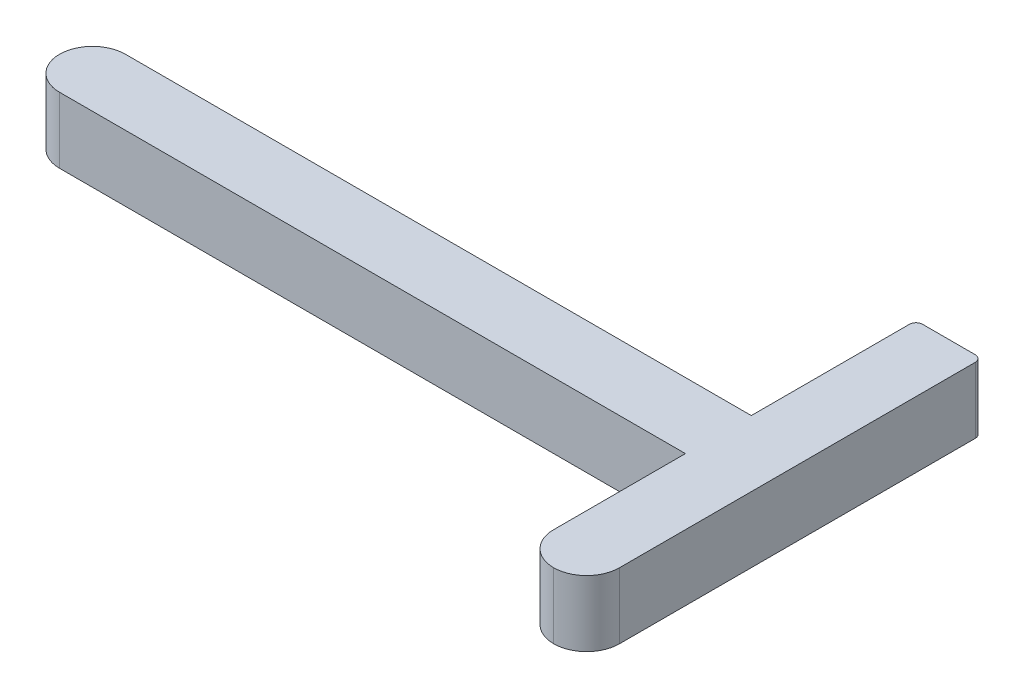
ISO-10303-21;
HEADER;
FILE_DESCRIPTION(('STEP AP214'),'2;1');
FILE_NAME('part.step','',(''),(''),'','','');
FILE_SCHEMA(('AUTOMOTIVE_DESIGN { 1 0 10303 214 1 1 1 1 }'));
ENDSEC;
DATA;
#1=APPLICATION_CONTEXT('core data for automotive mechanical design processes');
#2=APPLICATION_PROTOCOL_DEFINITION('international standard','automotive_design',2000,#1);
#3=PRODUCT_CONTEXT('',#1,'mechanical');
#4=PRODUCT('Part','Part','',(#3));
#5=PRODUCT_RELATED_PRODUCT_CATEGORY('part','',(#4));
#6=PRODUCT_DEFINITION_FORMATION('','',#4);
#7=PRODUCT_DEFINITION_CONTEXT('part definition',#1,'design');
#8=PRODUCT_DEFINITION('design','',#6,#7);
#9=PRODUCT_DEFINITION_SHAPE('','',#8);
#10=(LENGTH_UNIT() NAMED_UNIT(*) SI_UNIT(.MILLI.,.METRE.));
#11=(NAMED_UNIT(*) PLANE_ANGLE_UNIT() SI_UNIT($,.RADIAN.));
#12=(NAMED_UNIT(*) SI_UNIT($,.STERADIAN.) SOLID_ANGLE_UNIT());
#13=UNCERTAINTY_MEASURE_WITH_UNIT(LENGTH_MEASURE(1.E-05),#10,'distance_accuracy_value','');
#14=(GEOMETRIC_REPRESENTATION_CONTEXT(3) GLOBAL_UNCERTAINTY_ASSIGNED_CONTEXT((#13)) GLOBAL_UNIT_ASSIGNED_CONTEXT((#10,
#11,#12)) REPRESENTATION_CONTEXT('',''));
#15=CARTESIAN_POINT('',(0.,0.,0.));
#16=DIRECTION('',(0.,0.,1.));
#17=DIRECTION('',(1.,0.,0.));
#18=AXIS2_PLACEMENT_3D('',#15,#16,#17);
#19=CARTESIAN_POINT('',(-45.,10.,0.));
#20=DIRECTION('',(0.,1.,0.));
#21=DIRECTION('',(0.,0.,1.));
#22=AXIS2_PLACEMENT_3D('',#19,#20,#21);
#23=CYLINDRICAL_SURFACE('',#22,5.);
#24=DIRECTION('',(0.,-1.,0.));
#25=VECTOR('',#24,1.);
#26=CARTESIAN_POINT('',(-50.,0.,0.));
#27=LINE('',#26,#25);
#28=CARTESIAN_POINT('',(-50.,4.5,0.));
#29=VERTEX_POINT('',#28);
#30=CARTESIAN_POINT('',(-50.,0.,0.));
#31=VERTEX_POINT('',#30);
#32=EDGE_CURVE('E244',#29,#31,#27,.T.);
#33=ORIENTED_EDGE('',*,*,#32,.F.);
#34=CARTESIAN_POINT('',(-45.,4.5,0.));
#35=DIRECTION('',(0.,1.,0.));
#36=DIRECTION('',(0.,0.,1.));
#37=AXIS2_PLACEMENT_3D('',#34,#35,#36);
#38=CIRCLE('',#37,5.);
#39=CARTESIAN_POINT('',(-49.7696960070847,4.5,-1.5));
#40=VERTEX_POINT('',#39);
#41=EDGE_CURVE('E230',#29,#40,#38,.F.);
#42=ORIENTED_EDGE('',*,*,#41,.T.);
#43=DIRECTION('',(0.,1.,0.));
#44=VECTOR('',#43,1.);
#45=CARTESIAN_POINT('',(-49.7696960070847,10.,-1.5));
#46=LINE('',#45,#44);
#47=CARTESIAN_POINT('',(-49.7696960070847,5.5,-1.5));
#48=VERTEX_POINT('',#47);
#49=EDGE_CURVE('E12',#40,#48,#46,.T.);
#50=ORIENTED_EDGE('',*,*,#49,.T.);
#51=CARTESIAN_POINT('',(-45.,5.5,0.));
#52=DIRECTION('',(0.,-1.,0.));
#53=DIRECTION('',(0.,0.,-1.));
#54=AXIS2_PLACEMENT_3D('',#51,#52,#53);
#55=CIRCLE('',#54,5.);
#56=CARTESIAN_POINT('',(-50.,5.5,0.));
#57=VERTEX_POINT('',#56);
#58=EDGE_CURVE('E209',#48,#57,#55,.F.);
#59=ORIENTED_EDGE('',*,*,#58,.T.);
#60=CARTESIAN_POINT('',(-50.,10.,0.));
#61=VERTEX_POINT('',#60);
#62=EDGE_CURVE('E299',#61,#57,#27,.T.);
#63=ORIENTED_EDGE('',*,*,#62,.F.);
#64=CARTESIAN_POINT('',(-45.,10.,0.));
#65=DIRECTION('',(0.,-1.,0.));
#66=DIRECTION('',(0.,0.,-1.));
#67=AXIS2_PLACEMENT_3D('',#64,#65,#66);
#68=CIRCLE('',#67,5.);
#69=CARTESIAN_POINT('',(-45.,10.,-5.));
#70=VERTEX_POINT('',#69);
#71=EDGE_CURVE('E307',#70,#61,#68,.F.);
#72=ORIENTED_EDGE('',*,*,#71,.F.);
#73=DIRECTION('',(0.,-1.,0.));
#74=VECTOR('',#73,1.);
#75=CARTESIAN_POINT('',(-45.,10.,-5.));
#76=LINE('',#75,#74);
#77=CARTESIAN_POINT('',(-45.,0.,-5.));
#78=VERTEX_POINT('',#77);
#79=EDGE_CURVE('E311',#78,#70,#76,.F.);
#80=ORIENTED_EDGE('',*,*,#79,.F.);
#81=CARTESIAN_POINT('',(-45.,0.,0.));
#82=DIRECTION('',(0.,-1.,0.));
#83=DIRECTION('',(0.,0.,-1.));
#84=AXIS2_PLACEMENT_3D('',#81,#82,#83);
#85=CIRCLE('',#84,5.);
#86=EDGE_CURVE('E302',#31,#78,#85,.T.);
#87=ORIENTED_EDGE('',*,*,#86,.F.);
#88=EDGE_LOOP('',(#33,#42,#50,#59,#63,#72,#80,#87));
#89=FACE_BOUND('',#88,.T.);
#90=ADVANCED_FACE('F71',(#89),#23,.T.);
#91=CARTESIAN_POINT('',(-45.,10.,0.));
#92=DIRECTION('',(0.,-1.,0.));
#93=DIRECTION('',(0.,0.,-1.));
#94=AXIS2_PLACEMENT_3D('',#91,#92,#93);
#95=CYLINDRICAL_SURFACE('',#94,5.);
#96=DIRECTION('',(0.,-1.,0.));
#97=VECTOR('',#96,1.);
#98=CARTESIAN_POINT('',(-49.7696960070847,10.,1.5));
#99=LINE('',#98,#97);
#100=CARTESIAN_POINT('',(-49.7696960070847,5.5,1.5));
#101=VERTEX_POINT('',#100);
#102=CARTESIAN_POINT('',(-49.7696960070847,4.5,1.5));
#103=VERTEX_POINT('',#102);
#104=EDGE_CURVE('E195',#101,#103,#99,.T.);
#105=ORIENTED_EDGE('',*,*,#104,.T.);
#106=CARTESIAN_POINT('',(-45.,4.5,0.));
#107=DIRECTION('',(0.,1.,0.));
#108=DIRECTION('',(0.,0.,1.));
#109=AXIS2_PLACEMENT_3D('',#106,#107,#108);
#110=CIRCLE('',#109,5.);
#111=EDGE_CURVE('E79',#103,#29,#110,.F.);
#112=ORIENTED_EDGE('',*,*,#111,.T.);
#113=ORIENTED_EDGE('',*,*,#32,.T.);
#114=CARTESIAN_POINT('',(-45.,0.,0.));
#115=DIRECTION('',(0.,-1.,0.));
#116=DIRECTION('',(0.,0.,-1.));
#117=AXIS2_PLACEMENT_3D('',#114,#115,#116);
#118=CIRCLE('',#117,5.);
#119=CARTESIAN_POINT('',(-45.,0.,5.));
#120=VERTEX_POINT('',#119);
#121=EDGE_CURVE('E304',#120,#31,#118,.T.);
#122=ORIENTED_EDGE('',*,*,#121,.F.);
#123=DIRECTION('',(0.,-1.,0.));
#124=VECTOR('',#123,1.);
#125=CARTESIAN_POINT('',(-45.,10.,5.));
#126=LINE('',#125,#124);
#127=CARTESIAN_POINT('',(-45.,10.,5.));
#128=VERTEX_POINT('',#127);
#129=EDGE_CURVE('E296',#128,#120,#126,.T.);
#130=ORIENTED_EDGE('',*,*,#129,.F.);
#131=CARTESIAN_POINT('',(-45.,10.,0.));
#132=DIRECTION('',(0.,-1.,0.));
#133=DIRECTION('',(0.,0.,-1.));
#134=AXIS2_PLACEMENT_3D('',#131,#132,#133);
#135=CIRCLE('',#134,5.);
#136=EDGE_CURVE('E309',#61,#128,#135,.F.);
#137=ORIENTED_EDGE('',*,*,#136,.F.);
#138=ORIENTED_EDGE('',*,*,#62,.T.);
#139=CARTESIAN_POINT('',(-45.,5.5,0.));
#140=DIRECTION('',(0.,-1.,0.));
#141=DIRECTION('',(0.,0.,-1.));
#142=AXIS2_PLACEMENT_3D('',#139,#140,#141);
#143=CIRCLE('',#142,5.);
#144=EDGE_CURVE('E333',#57,#101,#143,.F.);
#145=ORIENTED_EDGE('',*,*,#144,.T.);
#146=EDGE_LOOP('',(#105,#112,#113,#122,#130,#137,#138,#145));
#147=FACE_BOUND('',#146,.T.);
#148=ADVANCED_FACE('F337',(#147),#95,.T.);
#149=CARTESIAN_POINT('',(50.,10.,-30.));
#150=DIRECTION('',(1.,0.,0.));
#151=DIRECTION('',(0.,0.,-1.));
#152=AXIS2_PLACEMENT_3D('',#149,#150,#151);
#153=PLANE('',#152);
#154=DIRECTION('',(0.,0.,1.));
#155=VECTOR('',#154,1.);
#156=CARTESIAN_POINT('',(50.,10.,-30.));
#157=LINE('',#156,#155);
#158=CARTESIAN_POINT('',(50.,10.,-29.));
#159=VERTEX_POINT('',#158);
#160=CARTESIAN_POINT('',(50.,10.,-5.00000000000001));
#161=VERTEX_POINT('',#160);
#162=EDGE_CURVE('E245',#159,#161,#157,.T.);
#163=ORIENTED_EDGE('',*,*,#162,.F.);
#164=DIRECTION('',(0.,-1.,0.));
#165=VECTOR('',#164,1.);
#166=CARTESIAN_POINT('',(50.,0.,-29.));
#167=LINE('',#166,#165);
#168=CARTESIAN_POINT('',(50.,0.,-29.));
#169=VERTEX_POINT('',#168);
#170=EDGE_CURVE('E313',#159,#169,#167,.T.);
#171=ORIENTED_EDGE('',*,*,#170,.T.);
#172=DIRECTION('',(0.,0.,1.));
#173=VECTOR('',#172,1.);
#174=CARTESIAN_POINT('',(50.,0.,-30.));
#175=LINE('',#174,#173);
#176=CARTESIAN_POINT('',(50.,0.,-5.00000000000001));
#177=VERTEX_POINT('',#176);
#178=EDGE_CURVE('E263',#169,#177,#175,.T.);
#179=ORIENTED_EDGE('',*,*,#178,.T.);
#180=DIRECTION('',(0.,-1.,0.));
#181=VECTOR('',#180,1.);
#182=CARTESIAN_POINT('',(50.,10.,-5.00000000000001));
#183=LINE('',#182,#181);
#184=EDGE_CURVE('E280',#161,#177,#183,.T.);
#185=ORIENTED_EDGE('',*,*,#184,.F.);
#186=EDGE_LOOP('',(#163,#171,#179,#185));
#187=FACE_BOUND('',#186,.T.);
#188=ADVANCED_FACE('F353',(#187),#153,.F.);
#189=CARTESIAN_POINT('',(50.,10.,-5.00000000000001));
#190=DIRECTION('',(0.,0.,1.));
#191=DIRECTION('',(1.,0.,0.));
#192=AXIS2_PLACEMENT_3D('',#189,#190,#191);
#193=PLANE('',#192);
#194=DIRECTION('',(-1.,0.,0.));
#195=VECTOR('',#194,1.);
#196=CARTESIAN_POINT('',(50.,0.,-5.00000000000001));
#197=LINE('',#196,#195);
#198=EDGE_CURVE('E265',#177,#78,#197,.T.);
#199=ORIENTED_EDGE('',*,*,#198,.T.);
#200=ORIENTED_EDGE('',*,*,#79,.T.);
#201=DIRECTION('',(-1.,0.,0.));
#202=VECTOR('',#201,1.);
#203=CARTESIAN_POINT('',(50.,10.,-5.00000000000001));
#204=LINE('',#203,#202);
#205=EDGE_CURVE('E247',#161,#70,#204,.T.);
#206=ORIENTED_EDGE('',*,*,#205,.F.);
#207=ORIENTED_EDGE('',*,*,#184,.T.);
#208=EDGE_LOOP('',(#199,#200,#206,#207));
#209=FACE_BOUND('',#208,.T.);
#210=ADVANCED_FACE('F348',(#209),#193,.F.);
#211=CARTESIAN_POINT('',(50.,10.,4.99999999999999));
#212=DIRECTION('',(0.,0.,1.));
#213=DIRECTION('',(1.,0.,0.));
#214=AXIS2_PLACEMENT_3D('',#211,#212,#213);
#215=PLANE('',#214);
#216=DIRECTION('',(-1.,0.,0.));
#217=VECTOR('',#216,1.);
#218=CARTESIAN_POINT('',(50.,10.,4.99999999999999));
#219=LINE('',#218,#217);
#220=CARTESIAN_POINT('',(50.,10.,4.99999999999999));
#221=VERTEX_POINT('',#220);
#222=EDGE_CURVE('E251',#221,#128,#219,.T.);
#223=ORIENTED_EDGE('',*,*,#222,.T.);
#224=ORIENTED_EDGE('',*,*,#129,.T.);
#225=DIRECTION('',(-1.,0.,0.));
#226=VECTOR('',#225,1.);
#227=CARTESIAN_POINT('',(50.,0.,4.99999999999999));
#228=LINE('',#227,#226);
#229=CARTESIAN_POINT('',(50.,0.,4.99999999999999));
#230=VERTEX_POINT('',#229);
#231=EDGE_CURVE('E269',#230,#120,#228,.T.);
#232=ORIENTED_EDGE('',*,*,#231,.F.);
#233=DIRECTION('',(0.,-1.,0.));
#234=VECTOR('',#233,1.);
#235=CARTESIAN_POINT('',(50.,10.,4.99999999999999));
#236=LINE('',#235,#234);
#237=EDGE_CURVE('E262',#221,#230,#236,.T.);
#238=ORIENTED_EDGE('',*,*,#237,.F.);
#239=EDGE_LOOP('',(#223,#224,#232,#238));
#240=FACE_BOUND('',#239,.T.);
#241=ADVANCED_FACE('F388',(#240),#215,.T.);
#242=CARTESIAN_POINT('',(50.,10.,4.99999999999999));
#243=DIRECTION('',(1.,0.,0.));
#244=DIRECTION('',(0.,0.,-1.));
#245=AXIS2_PLACEMENT_3D('',#242,#243,#244);
#246=PLANE('',#245);
#247=DIRECTION('',(0.,0.,1.));
#248=VECTOR('',#247,1.);
#249=CARTESIAN_POINT('',(50.,0.,4.99999999999999));
#250=LINE('',#249,#248);
#251=CARTESIAN_POINT('',(50.,0.,25.));
#252=VERTEX_POINT('',#251);
#253=EDGE_CURVE('E272',#230,#252,#250,.T.);
#254=ORIENTED_EDGE('',*,*,#253,.T.);
#255=DIRECTION('',(0.,-1.,0.));
#256=VECTOR('',#255,1.);
#257=CARTESIAN_POINT('',(50.,10.,25.));
#258=LINE('',#257,#256);
#259=CARTESIAN_POINT('',(50.,10.,25.));
#260=VERTEX_POINT('',#259);
#261=EDGE_CURVE('E294',#252,#260,#258,.F.);
#262=ORIENTED_EDGE('',*,*,#261,.T.);
#263=DIRECTION('',(0.,0.,1.));
#264=VECTOR('',#263,1.);
#265=CARTESIAN_POINT('',(50.,10.,4.99999999999999));
#266=LINE('',#265,#264);
#267=EDGE_CURVE('E254',#221,#260,#266,.T.);
#268=ORIENTED_EDGE('',*,*,#267,.F.);
#269=ORIENTED_EDGE('',*,*,#237,.T.);
#270=EDGE_LOOP('',(#254,#262,#268,#269));
#271=FACE_BOUND('',#270,.T.);
#272=ADVANCED_FACE('F383',(#271),#246,.F.);
#273=CARTESIAN_POINT('',(60.,10.,30.));
#274=DIRECTION('',(-1.,0.,0.));
#275=DIRECTION('',(0.,0.,1.));
#276=AXIS2_PLACEMENT_3D('',#273,#274,#275);
#277=PLANE('',#276);
#278=DIRECTION('',(0.,0.,-1.));
#279=VECTOR('',#278,1.);
#280=CARTESIAN_POINT('',(60.,0.,30.));
#281=LINE('',#280,#279);
#282=CARTESIAN_POINT('',(60.,0.,25.));
#283=VERTEX_POINT('',#282);
#284=CARTESIAN_POINT('',(60.,0.,-29.));
#285=VERTEX_POINT('',#284);
#286=EDGE_CURVE('E275',#283,#285,#281,.T.);
#287=ORIENTED_EDGE('',*,*,#286,.T.);
#288=DIRECTION('',(0.,-1.,0.));
#289=VECTOR('',#288,1.);
#290=CARTESIAN_POINT('',(60.,10.,-29.));
#291=LINE('',#290,#289);
#292=CARTESIAN_POINT('',(60.,10.,-29.));
#293=VERTEX_POINT('',#292);
#294=EDGE_CURVE('E94',#285,#293,#291,.F.);
#295=ORIENTED_EDGE('',*,*,#294,.T.);
#296=DIRECTION('',(0.,0.,-1.));
#297=VECTOR('',#296,1.);
#298=CARTESIAN_POINT('',(60.,10.,30.));
#299=LINE('',#298,#297);
#300=CARTESIAN_POINT('',(60.,10.,25.));
#301=VERTEX_POINT('',#300);
#302=EDGE_CURVE('E257',#301,#293,#299,.T.);
#303=ORIENTED_EDGE('',*,*,#302,.F.);
#304=DIRECTION('',(0.,-1.,0.));
#305=VECTOR('',#304,1.);
#306=CARTESIAN_POINT('',(60.,10.,25.));
#307=LINE('',#306,#305);
#308=EDGE_CURVE('E283',#301,#283,#307,.T.);
#309=ORIENTED_EDGE('',*,*,#308,.T.);
#310=EDGE_LOOP('',(#287,#295,#303,#309));
#311=FACE_BOUND('',#310,.T.);
#312=ADVANCED_FACE('F369',(#311),#277,.F.);
#313=CARTESIAN_POINT('',(50.,10.,-30.));
#314=DIRECTION('',(0.,0.,-1.));
#315=DIRECTION('',(-1.,0.,0.));
#316=AXIS2_PLACEMENT_3D('',#313,#314,#315);
#317=PLANE('',#316);
#318=DIRECTION('',(1.,0.,0.));
#319=VECTOR('',#318,1.);
#320=CARTESIAN_POINT('',(50.,10.,-30.));
#321=LINE('',#320,#319);
#322=CARTESIAN_POINT('',(51.,10.,-30.));
#323=VERTEX_POINT('',#322);
#324=CARTESIAN_POINT('',(59.,10.,-30.));
#325=VERTEX_POINT('',#324);
#326=EDGE_CURVE('E259',#323,#325,#321,.T.);
#327=ORIENTED_EDGE('',*,*,#326,.T.);
#328=DIRECTION('',(0.,-1.,0.));
#329=VECTOR('',#328,1.);
#330=CARTESIAN_POINT('',(59.,0.,-30.));
#331=LINE('',#330,#329);
#332=CARTESIAN_POINT('',(59.,0.,-30.));
#333=VERTEX_POINT('',#332);
#334=EDGE_CURVE('E324',#325,#333,#331,.T.);
#335=ORIENTED_EDGE('',*,*,#334,.T.);
#336=DIRECTION('',(1.,0.,0.));
#337=VECTOR('',#336,1.);
#338=CARTESIAN_POINT('',(50.,0.,-30.));
#339=LINE('',#338,#337);
#340=CARTESIAN_POINT('',(51.,0.,-30.));
#341=VERTEX_POINT('',#340);
#342=EDGE_CURVE('E248',#341,#333,#339,.T.);
#343=ORIENTED_EDGE('',*,*,#342,.F.);
#344=DIRECTION('',(0.,-1.,0.));
#345=VECTOR('',#344,1.);
#346=CARTESIAN_POINT('',(51.,10.,-30.));
#347=LINE('',#346,#345);
#348=EDGE_CURVE('E320',#341,#323,#347,.F.);
#349=ORIENTED_EDGE('',*,*,#348,.T.);
#350=EDGE_LOOP('',(#327,#335,#343,#349));
#351=FACE_BOUND('',#350,.T.);
#352=ADVANCED_FACE('F359',(#351),#317,.T.);
#353=CARTESIAN_POINT('',(0.,10.,0.));
#354=DIRECTION('',(0.,-1.,0.));
#355=DIRECTION('',(0.,0.,-1.));
#356=AXIS2_PLACEMENT_3D('',#353,#354,#355);
#357=PLANE('',#356);
#358=ORIENTED_EDGE('',*,*,#302,.T.);
#359=CARTESIAN_POINT('',(59.,10.,-29.));
#360=DIRECTION('',(0.,-1.,0.));
#361=DIRECTION('',(0.,0.,-1.));
#362=AXIS2_PLACEMENT_3D('',#359,#360,#361);
#363=CIRCLE('',#362,1.);
#364=EDGE_CURVE('E330',#293,#325,#363,.F.);
#365=ORIENTED_EDGE('',*,*,#364,.T.);
#366=ORIENTED_EDGE('',*,*,#326,.F.);
#367=CARTESIAN_POINT('',(51.,10.,-29.));
#368=DIRECTION('',(0.,-1.,0.));
#369=DIRECTION('',(0.,0.,-1.));
#370=AXIS2_PLACEMENT_3D('',#367,#368,#369);
#371=CIRCLE('',#370,1.);
#372=EDGE_CURVE('E322',#323,#159,#371,.F.);
#373=ORIENTED_EDGE('',*,*,#372,.T.);
#374=ORIENTED_EDGE('',*,*,#162,.T.);
#375=ORIENTED_EDGE('',*,*,#205,.T.);
#376=ORIENTED_EDGE('',*,*,#71,.T.);
#377=ORIENTED_EDGE('',*,*,#136,.T.);
#378=ORIENTED_EDGE('',*,*,#222,.F.);
#379=ORIENTED_EDGE('',*,*,#267,.T.);
#380=CARTESIAN_POINT('',(55.,10.,25.));
#381=DIRECTION('',(0.,-1.,0.));
#382=DIRECTION('',(0.,0.,-1.));
#383=AXIS2_PLACEMENT_3D('',#380,#381,#382);
#384=CIRCLE('',#383,5.);
#385=CARTESIAN_POINT('',(55.,10.,30.));
#386=VERTEX_POINT('',#385);
#387=EDGE_CURVE('E290',#260,#386,#384,.F.);
#388=ORIENTED_EDGE('',*,*,#387,.T.);
#389=CARTESIAN_POINT('',(55.,10.,25.));
#390=DIRECTION('',(0.,-1.,0.));
#391=DIRECTION('',(0.,0.,-1.));
#392=AXIS2_PLACEMENT_3D('',#389,#390,#391);
#393=CIRCLE('',#392,5.);
#394=EDGE_CURVE('E292',#386,#301,#393,.F.);
#395=ORIENTED_EDGE('',*,*,#394,.T.);
#396=EDGE_LOOP('',(#358,#365,#366,#373,#374,#375,#376,#377,#378,#379,#388,#395));
#397=FACE_BOUND('',#396,.T.);
#398=ADVANCED_FACE('F365',(#397),#357,.F.);
#399=CARTESIAN_POINT('',(0.,0.,0.));
#400=DIRECTION('',(0.,-1.,0.));
#401=DIRECTION('',(0.,0.,-1.));
#402=AXIS2_PLACEMENT_3D('',#399,#400,#401);
#403=PLANE('',#402);
#404=ORIENTED_EDGE('',*,*,#342,.T.);
#405=CARTESIAN_POINT('',(59.,0.,-29.));
#406=DIRECTION('',(0.,-1.,0.));
#407=DIRECTION('',(0.,0.,-1.));
#408=AXIS2_PLACEMENT_3D('',#405,#406,#407);
#409=CIRCLE('',#408,1.);
#410=EDGE_CURVE('E327',#333,#285,#409,.T.);
#411=ORIENTED_EDGE('',*,*,#410,.T.);
#412=ORIENTED_EDGE('',*,*,#286,.F.);
#413=CARTESIAN_POINT('',(55.,0.,25.));
#414=DIRECTION('',(0.,-1.,0.));
#415=DIRECTION('',(0.,0.,-1.));
#416=AXIS2_PLACEMENT_3D('',#413,#414,#415);
#417=CIRCLE('',#416,5.);
#418=CARTESIAN_POINT('',(55.,0.,30.));
#419=VERTEX_POINT('',#418);
#420=EDGE_CURVE('E288',#283,#419,#417,.T.);
#421=ORIENTED_EDGE('',*,*,#420,.T.);
#422=CARTESIAN_POINT('',(55.,0.,25.));
#423=DIRECTION('',(0.,-1.,0.));
#424=DIRECTION('',(0.,0.,-1.));
#425=AXIS2_PLACEMENT_3D('',#422,#423,#424);
#426=CIRCLE('',#425,5.);
#427=EDGE_CURVE('E286',#419,#252,#426,.T.);
#428=ORIENTED_EDGE('',*,*,#427,.T.);
#429=ORIENTED_EDGE('',*,*,#253,.F.);
#430=ORIENTED_EDGE('',*,*,#231,.T.);
#431=ORIENTED_EDGE('',*,*,#121,.T.);
#432=ORIENTED_EDGE('',*,*,#86,.T.);
#433=ORIENTED_EDGE('',*,*,#198,.F.);
#434=ORIENTED_EDGE('',*,*,#178,.F.);
#435=CARTESIAN_POINT('',(51.,0.,-29.));
#436=DIRECTION('',(0.,-1.,0.));
#437=DIRECTION('',(0.,0.,-1.));
#438=AXIS2_PLACEMENT_3D('',#435,#436,#437);
#439=CIRCLE('',#438,1.);
#440=EDGE_CURVE('E318',#169,#341,#439,.T.);
#441=ORIENTED_EDGE('',*,*,#440,.T.);
#442=EDGE_LOOP('',(#404,#411,#412,#421,#428,#429,#430,#431,#432,#433,#434,#441));
#443=FACE_BOUND('',#442,.T.);
#444=ADVANCED_FACE('F345',(#443),#403,.T.);
#445=CARTESIAN_POINT('',(55.,10.,25.));
#446=DIRECTION('',(0.,-1.,0.));
#447=DIRECTION('',(0.,0.,-1.));
#448=AXIS2_PLACEMENT_3D('',#445,#446,#447);
#449=CYLINDRICAL_SURFACE('',#448,5.);
#450=DIRECTION('',(0.,-1.,0.));
#451=VECTOR('',#450,1.);
#452=CARTESIAN_POINT('',(55.,10.,30.));
#453=LINE('',#452,#451);
#454=EDGE_CURVE('E266',#386,#419,#453,.T.);
#455=ORIENTED_EDGE('',*,*,#454,.F.);
#456=ORIENTED_EDGE('',*,*,#387,.F.);
#457=ORIENTED_EDGE('',*,*,#261,.F.);
#458=ORIENTED_EDGE('',*,*,#427,.F.);
#459=EDGE_LOOP('',(#455,#456,#457,#458));
#460=FACE_BOUND('',#459,.T.);
#461=ADVANCED_FACE('F379',(#460),#449,.T.);
#462=CARTESIAN_POINT('',(55.,10.,25.));
#463=DIRECTION('',(0.,-1.,0.));
#464=DIRECTION('',(0.,0.,-1.));
#465=AXIS2_PLACEMENT_3D('',#462,#463,#464);
#466=CYLINDRICAL_SURFACE('',#465,5.);
#467=ORIENTED_EDGE('',*,*,#394,.F.);
#468=ORIENTED_EDGE('',*,*,#454,.T.);
#469=ORIENTED_EDGE('',*,*,#420,.F.);
#470=ORIENTED_EDGE('',*,*,#308,.F.);
#471=EDGE_LOOP('',(#467,#468,#469,#470));
#472=FACE_BOUND('',#471,.T.);
#473=ADVANCED_FACE('F373',(#472),#466,.T.);
#474=CARTESIAN_POINT('',(51.,10.,-29.));
#475=DIRECTION('',(0.,1.,0.));
#476=DIRECTION('',(0.,0.,1.));
#477=AXIS2_PLACEMENT_3D('',#474,#475,#476);
#478=CYLINDRICAL_SURFACE('',#477,1.);
#479=ORIENTED_EDGE('',*,*,#372,.F.);
#480=ORIENTED_EDGE('',*,*,#348,.F.);
#481=ORIENTED_EDGE('',*,*,#440,.F.);
#482=ORIENTED_EDGE('',*,*,#170,.F.);
#483=EDGE_LOOP('',(#479,#480,#481,#482));
#484=FACE_BOUND('',#483,.T.);
#485=ADVANCED_FACE('F363',(#484),#478,.T.);
#486=CARTESIAN_POINT('',(59.,10.,-29.));
#487=DIRECTION('',(0.,1.,0.));
#488=DIRECTION('',(0.,0.,1.));
#489=AXIS2_PLACEMENT_3D('',#486,#487,#488);
#490=CYLINDRICAL_SURFACE('',#489,1.);
#491=ORIENTED_EDGE('',*,*,#364,.F.);
#492=ORIENTED_EDGE('',*,*,#294,.F.);
#493=ORIENTED_EDGE('',*,*,#410,.F.);
#494=ORIENTED_EDGE('',*,*,#334,.F.);
#495=EDGE_LOOP('',(#491,#492,#493,#494));
#496=FACE_BOUND('',#495,.T.);
#497=ADVANCED_FACE('F73',(#496),#490,.T.);
#498=CARTESIAN_POINT('',(-20.,0.,2.48462911735947E-13));
#499=DIRECTION('',(1.,0.,0.));
#500=DIRECTION('',(0.,0.,-1.));
#501=AXIS2_PLACEMENT_3D('',#498,#499,#500);
#502=PLANE('',#501);
#503=DIRECTION('',(0.,1.,0.));
#504=VECTOR('',#503,1.);
#505=CARTESIAN_POINT('',(-20.,4.5,1.5));
#506=LINE('',#505,#504);
#507=CARTESIAN_POINT('',(-20.,4.5,1.5));
#508=VERTEX_POINT('',#507);
#509=CARTESIAN_POINT('',(-20.,5.5,1.5));
#510=VERTEX_POINT('',#509);
#511=EDGE_CURVE('E193',#508,#510,#506,.T.);
#512=ORIENTED_EDGE('',*,*,#511,.T.);
#513=DIRECTION('',(0.,0.,-1.));
#514=VECTOR('',#513,1.);
#515=CARTESIAN_POINT('',(-20.,5.5,-1.5));
#516=LINE('',#515,#514);
#517=CARTESIAN_POINT('',(-20.,5.5,-1.5));
#518=VERTEX_POINT('',#517);
#519=EDGE_CURVE('E199',#510,#518,#516,.T.);
#520=ORIENTED_EDGE('',*,*,#519,.T.);
#521=DIRECTION('',(0.,-1.,0.));
#522=VECTOR('',#521,1.);
#523=CARTESIAN_POINT('',(-20.,4.5,-1.5));
#524=LINE('',#523,#522);
#525=CARTESIAN_POINT('',(-20.,4.5,-1.5));
#526=VERTEX_POINT('',#525);
#527=EDGE_CURVE('E215',#518,#526,#524,.T.);
#528=ORIENTED_EDGE('',*,*,#527,.T.);
#529=DIRECTION('',(0.,0.,1.));
#530=VECTOR('',#529,1.);
#531=CARTESIAN_POINT('',(-20.,4.5,-1.5));
#532=LINE('',#531,#530);
#533=EDGE_CURVE('E208',#526,#508,#532,.T.);
#534=ORIENTED_EDGE('',*,*,#533,.T.);
#535=EDGE_LOOP('',(#512,#520,#528,#534));
#536=FACE_BOUND('',#535,.T.);
#537=ADVANCED_FACE('F204',(#536),#502,.F.);
#538=CARTESIAN_POINT('',(-50.,4.5,-1.5));
#539=DIRECTION('',(0.,1.,0.));
#540=DIRECTION('',(0.,0.,1.));
#541=AXIS2_PLACEMENT_3D('',#538,#539,#540);
#542=PLANE('',#541);
#543=ORIENTED_EDGE('',*,*,#111,.F.);
#544=DIRECTION('',(1.,0.,0.));
#545=VECTOR('',#544,1.);
#546=CARTESIAN_POINT('',(-50.,4.5,1.5));
#547=LINE('',#546,#545);
#548=EDGE_CURVE('E86',#103,#508,#547,.T.);
#549=ORIENTED_EDGE('',*,*,#548,.T.);
#550=ORIENTED_EDGE('',*,*,#533,.F.);
#551=DIRECTION('',(1.,0.,0.));
#552=VECTOR('',#551,1.);
#553=CARTESIAN_POINT('',(-50.,4.5,-1.5));
#554=LINE('',#553,#552);
#555=EDGE_CURVE('E231',#40,#526,#554,.T.);
#556=ORIENTED_EDGE('',*,*,#555,.F.);
#557=ORIENTED_EDGE('',*,*,#41,.F.);
#558=EDGE_LOOP('',(#543,#549,#550,#556,#557));
#559=FACE_BOUND('',#558,.T.);
#560=ADVANCED_FACE('F394',(#559),#542,.T.);
#561=CARTESIAN_POINT('',(-50.,4.5,-1.5));
#562=DIRECTION('',(0.,0.,1.));
#563=DIRECTION('',(1.,0.,0.));
#564=AXIS2_PLACEMENT_3D('',#561,#562,#563);
#565=PLANE('',#564);
#566=ORIENTED_EDGE('',*,*,#555,.T.);
#567=ORIENTED_EDGE('',*,*,#527,.F.);
#568=DIRECTION('',(1.,0.,0.));
#569=VECTOR('',#568,1.);
#570=CARTESIAN_POINT('',(-50.,5.5,-1.5));
#571=LINE('',#570,#569);
#572=EDGE_CURVE('E213',#48,#518,#571,.T.);
#573=ORIENTED_EDGE('',*,*,#572,.F.);
#574=ORIENTED_EDGE('',*,*,#49,.F.);
#575=EDGE_LOOP('',(#566,#567,#573,#574));
#576=FACE_BOUND('',#575,.T.);
#577=ADVANCED_FACE('F392',(#576),#565,.T.);
#578=CARTESIAN_POINT('',(-50.,5.5,-1.5));
#579=DIRECTION('',(0.,-1.,0.));
#580=DIRECTION('',(0.,0.,-1.));
#581=AXIS2_PLACEMENT_3D('',#578,#579,#580);
#582=PLANE('',#581);
#583=ORIENTED_EDGE('',*,*,#572,.T.);
#584=ORIENTED_EDGE('',*,*,#519,.F.);
#585=DIRECTION('',(1.,0.,0.));
#586=VECTOR('',#585,1.);
#587=CARTESIAN_POINT('',(-50.,5.5,1.5));
#588=LINE('',#587,#586);
#589=EDGE_CURVE('E190',#101,#510,#588,.T.);
#590=ORIENTED_EDGE('',*,*,#589,.F.);
#591=ORIENTED_EDGE('',*,*,#144,.F.);
#592=ORIENTED_EDGE('',*,*,#58,.F.);
#593=EDGE_LOOP('',(#583,#584,#590,#591,#592));
#594=FACE_BOUND('',#593,.T.);
#595=ADVANCED_FACE('F211',(#594),#582,.T.);
#596=CARTESIAN_POINT('',(-50.,4.5,1.5));
#597=DIRECTION('',(0.,0.,-1.));
#598=DIRECTION('',(-1.,0.,0.));
#599=AXIS2_PLACEMENT_3D('',#596,#597,#598);
#600=PLANE('',#599);
#601=ORIENTED_EDGE('',*,*,#589,.T.);
#602=ORIENTED_EDGE('',*,*,#511,.F.);
#603=ORIENTED_EDGE('',*,*,#548,.F.);
#604=ORIENTED_EDGE('',*,*,#104,.F.);
#605=EDGE_LOOP('',(#601,#602,#603,#604));
#606=FACE_BOUND('',#605,.T.);
#607=ADVANCED_FACE('F192',(#606),#600,.T.);
#608=CLOSED_SHELL('',(#90,#148,#188,#210,#241,#272,#312,#352,#398,#444,#461,#473,#485,#497,#537,
#560,#577,#595,#607));
#609=MANIFOLD_SOLID_BREP('B2',#608);
#610=ADVANCED_BREP_SHAPE_REPRESENTATION('',(#18,#609),#14);
#611=SHAPE_DEFINITION_REPRESENTATION(#9,#610);
ENDSEC;
END-ISO-10303-21;
